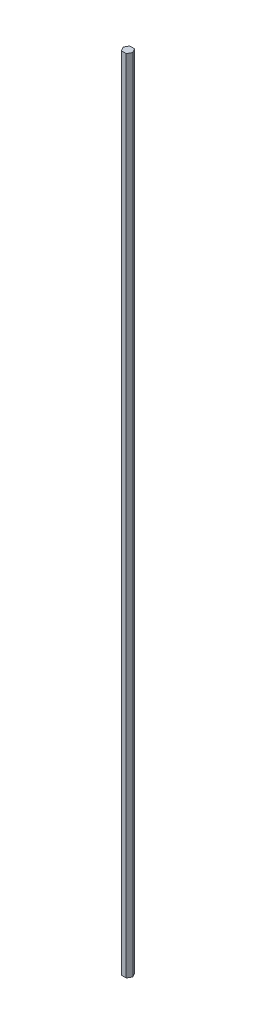
ISO-10303-21;
HEADER;
FILE_DESCRIPTION(('STEP AP214'),'2;1');
FILE_NAME('part.step','',(''),(''),'','','');
FILE_SCHEMA(('AUTOMOTIVE_DESIGN { 1 0 10303 214 1 1 1 1 }'));
ENDSEC;
DATA;
#1=APPLICATION_CONTEXT('core data for automotive mechanical design processes');
#2=APPLICATION_PROTOCOL_DEFINITION('international standard','automotive_design',2000,#1);
#3=PRODUCT_CONTEXT('',#1,'mechanical');
#4=PRODUCT('Part','Part','',(#3));
#5=PRODUCT_RELATED_PRODUCT_CATEGORY('part','',(#4));
#6=PRODUCT_DEFINITION_FORMATION('','',#4);
#7=PRODUCT_DEFINITION_CONTEXT('part definition',#1,'design');
#8=PRODUCT_DEFINITION('design','',#6,#7);
#9=PRODUCT_DEFINITION_SHAPE('','',#8);
#10=(LENGTH_UNIT() NAMED_UNIT(*) SI_UNIT(.MILLI.,.METRE.));
#11=(NAMED_UNIT(*) PLANE_ANGLE_UNIT() SI_UNIT($,.RADIAN.));
#12=(NAMED_UNIT(*) SI_UNIT($,.STERADIAN.) SOLID_ANGLE_UNIT());
#13=UNCERTAINTY_MEASURE_WITH_UNIT(LENGTH_MEASURE(1.E-05),#10,'distance_accuracy_value','');
#14=(GEOMETRIC_REPRESENTATION_CONTEXT(3) GLOBAL_UNCERTAINTY_ASSIGNED_CONTEXT((#13)) GLOBAL_UNIT_ASSIGNED_CONTEXT((#10,
#11,#12)) REPRESENTATION_CONTEXT('',''));
#15=CARTESIAN_POINT('',(0.,0.,0.));
#16=DIRECTION('',(0.,0.,1.));
#17=DIRECTION('',(1.,0.,0.));
#18=AXIS2_PLACEMENT_3D('',#15,#16,#17);
#19=CARTESIAN_POINT('',(-1.36356812882922,304.8,0.447318358355386));
#20=DIRECTION('',(-8.58853978460093E-05,0.,-0.999999996311849));
#21=DIRECTION('',(-0.999999996311849,0.,8.58853978460093E-05));
#22=AXIS2_PLACEMENT_3D('',#19,#20,#21);
#23=PLANE('',#22);
#24=DIRECTION('',(0.999999996311849,0.,-8.58853978460093E-05));
#25=VECTOR('',#24,1.);
#26=CARTESIAN_POINT('',(-1.36356812882922,0.,0.447318358355386));
#27=LINE('',#26,#25);
#28=CARTESIAN_POINT('',(-1.36356812882922,0.,0.447318358355386));
#29=VERTEX_POINT('',#28);
#30=CARTESIAN_POINT('',(0.469518969087139,0.,0.447160922940114));
#31=VERTEX_POINT('',#30);
#32=EDGE_CURVE('E117',#29,#31,#27,.T.);
#33=ORIENTED_EDGE('',*,*,#32,.T.);
#34=DIRECTION('',(0.,-1.,0.));
#35=VECTOR('',#34,1.);
#36=CARTESIAN_POINT('',(0.469518969087139,304.8,0.447160922940114));
#37=LINE('',#36,#35);
#38=CARTESIAN_POINT('',(0.469518969087139,304.8,0.447160922940114));
#39=VERTEX_POINT('',#38);
#40=EDGE_CURVE('E11',#39,#31,#37,.T.);
#41=ORIENTED_EDGE('',*,*,#40,.F.);
#42=DIRECTION('',(0.999999996311849,0.,-8.58853978460093E-05));
#43=VECTOR('',#42,1.);
#44=CARTESIAN_POINT('',(-1.36356812882922,304.8,0.447318358355386));
#45=LINE('',#44,#43);
#46=CARTESIAN_POINT('',(-1.36356812882922,304.8,0.447318358355386));
#47=VERTEX_POINT('',#46);
#48=EDGE_CURVE('E127',#47,#39,#45,.T.);
#49=ORIENTED_EDGE('',*,*,#48,.F.);
#50=DIRECTION('',(0.,-1.,0.));
#51=VECTOR('',#50,1.);
#52=CARTESIAN_POINT('',(-1.36356812882922,304.8,0.447318358355386));
#53=LINE('',#52,#51);
#54=EDGE_CURVE('E113',#47,#29,#53,.T.);
#55=ORIENTED_EDGE('',*,*,#54,.T.);
#56=EDGE_LOOP('',(#33,#41,#49,#55));
#57=FACE_BOUND('',#56,.T.);
#58=ADVANCED_FACE('F33',(#57),#23,.F.);
#59=CARTESIAN_POINT('',(0.469518969087139,304.8,0.447160922940114));
#60=DIRECTION('',(-0.86606834328933,0.,-0.499925619219575));
#61=DIRECTION('',(-0.499925619219575,0.,0.86606834328933));
#62=AXIS2_PLACEMENT_3D('',#59,#60,#61);
#63=PLANE('',#62);
#64=DIRECTION('',(0.499925619219575,0.,-0.86606834328933));
#65=VECTOR('',#64,1.);
#66=CARTESIAN_POINT('',(0.469518969087139,0.,0.447160922940114));
#67=LINE('',#66,#65);
#68=CARTESIAN_POINT('',(1.38592617497624,0.,-1.14041778891258));
#69=VERTEX_POINT('',#68);
#70=EDGE_CURVE('E120',#31,#69,#67,.T.);
#71=ORIENTED_EDGE('',*,*,#70,.T.);
#72=DIRECTION('',(0.,-1.,0.));
#73=VECTOR('',#72,1.);
#74=CARTESIAN_POINT('',(1.38592617497624,304.8,-1.14041778891258));
#75=LINE('',#74,#73);
#76=CARTESIAN_POINT('',(1.38592617497624,304.8,-1.14041778891258));
#77=VERTEX_POINT('',#76);
#78=EDGE_CURVE('E41',#77,#69,#75,.T.);
#79=ORIENTED_EDGE('',*,*,#78,.F.);
#80=DIRECTION('',(0.499925619219575,0.,-0.86606834328933));
#81=VECTOR('',#80,1.);
#82=CARTESIAN_POINT('',(0.469518969087139,304.8,0.447160922940114));
#83=LINE('',#82,#81);
#84=EDGE_CURVE('E86',#39,#77,#83,.T.);
#85=ORIENTED_EDGE('',*,*,#84,.F.);
#86=ORIENTED_EDGE('',*,*,#40,.T.);
#87=EDGE_LOOP('',(#71,#79,#85,#86));
#88=FACE_BOUND('',#87,.T.);
#89=ADVANCED_FACE('F151',(#88),#63,.F.);
#90=CARTESIAN_POINT('',(1.38592617497624,304.8,-1.14041778891258));
#91=DIRECTION('',(-0.865982457891483,0.,0.500074377092274));
#92=DIRECTION('',(0.500074377092274,0.,0.865982457891483));
#93=AXIS2_PLACEMENT_3D('',#90,#91,#92);
#94=PLANE('',#93);
#95=DIRECTION('',(-0.500074377092274,0.,-0.865982457891483));
#96=VECTOR('',#95,1.);
#97=CARTESIAN_POINT('',(1.38592617497624,0.,-1.14041778891258));
#98=LINE('',#97,#96);
#99=CARTESIAN_POINT('',(0.469246282948977,0.,-2.72783906535001));
#100=VERTEX_POINT('',#99);
#101=EDGE_CURVE('E122',#69,#100,#98,.T.);
#102=ORIENTED_EDGE('',*,*,#101,.T.);
#103=DIRECTION('',(0.,-1.,0.));
#104=VECTOR('',#103,1.);
#105=CARTESIAN_POINT('',(0.469246282948977,304.8,-2.72783906535001));
#106=LINE('',#105,#104);
#107=CARTESIAN_POINT('',(0.469246282948977,304.8,-2.72783906535001));
#108=VERTEX_POINT('',#107);
#109=EDGE_CURVE('E108',#108,#100,#106,.T.);
#110=ORIENTED_EDGE('',*,*,#109,.F.);
#111=DIRECTION('',(-0.500074377092274,0.,-0.865982457891483));
#112=VECTOR('',#111,1.);
#113=CARTESIAN_POINT('',(1.38592617497624,304.8,-1.14041778891258));
#114=LINE('',#113,#112);
#115=EDGE_CURVE('E99',#77,#108,#114,.T.);
#116=ORIENTED_EDGE('',*,*,#115,.F.);
#117=ORIENTED_EDGE('',*,*,#78,.T.);
#118=EDGE_LOOP('',(#102,#110,#116,#117));
#119=FACE_BOUND('',#118,.T.);
#120=ADVANCED_FACE('F133',(#119),#94,.F.);
#121=CARTESIAN_POINT('',(0.469246282948977,304.8,-2.72783906535001));
#122=DIRECTION('',(8.58853978460981E-05,0.,0.999999996311849));
#123=DIRECTION('',(0.999999996311849,0.,-8.58853978460981E-05));
#124=AXIS2_PLACEMENT_3D('',#121,#122,#123);
#125=PLANE('',#124);
#126=DIRECTION('',(-0.999999996311849,0.,8.58853978460981E-05));
#127=VECTOR('',#126,1.);
#128=CARTESIAN_POINT('',(0.469246282948977,0.,-2.72783906535001));
#129=LINE('',#128,#127);
#130=CARTESIAN_POINT('',(-1.36384081496738,0.,-2.72768162993474));
#131=VERTEX_POINT('',#130);
#132=EDGE_CURVE('E107',#100,#131,#129,.T.);
#133=ORIENTED_EDGE('',*,*,#132,.T.);
#134=DIRECTION('',(0.,-1.,0.));
#135=VECTOR('',#134,1.);
#136=CARTESIAN_POINT('',(-1.36384081496738,304.8,-2.72768162993474));
#137=LINE('',#136,#135);
#138=CARTESIAN_POINT('',(-1.36384081496738,304.8,-2.72768162993474));
#139=VERTEX_POINT('',#138);
#140=EDGE_CURVE('E104',#139,#131,#137,.T.);
#141=ORIENTED_EDGE('',*,*,#140,.F.);
#142=DIRECTION('',(-0.999999996311849,0.,8.58853978460981E-05));
#143=VECTOR('',#142,1.);
#144=CARTESIAN_POINT('',(0.469246282948977,304.8,-2.72783906535001));
#145=LINE('',#144,#143);
#146=EDGE_CURVE('E93',#108,#139,#145,.T.);
#147=ORIENTED_EDGE('',*,*,#146,.F.);
#148=ORIENTED_EDGE('',*,*,#109,.T.);
#149=EDGE_LOOP('',(#133,#141,#147,#148));
#150=FACE_BOUND('',#149,.T.);
#151=ADVANCED_FACE('F105',(#150),#125,.F.);
#152=CARTESIAN_POINT('',(-1.36384081496738,304.8,-2.72768162993474));
#153=DIRECTION('',(0.866068343289329,0.,0.499925619219576));
#154=DIRECTION('',(0.499925619219576,0.,-0.86606834328933));
#155=AXIS2_PLACEMENT_3D('',#152,#153,#154);
#156=PLANE('',#155);
#157=DIRECTION('',(-0.499925619219576,0.,0.866068343289329));
#158=VECTOR('',#157,1.);
#159=CARTESIAN_POINT('',(-1.36384081496738,0.,-2.72768162993474));
#160=LINE('',#159,#158);
#161=CARTESIAN_POINT('',(-2.28024802085648,0.,-1.14010291808204));
#162=VERTEX_POINT('',#161);
#163=EDGE_CURVE('E72',#131,#162,#160,.T.);
#164=ORIENTED_EDGE('',*,*,#163,.T.);
#165=DIRECTION('',(0.,-1.,0.));
#166=VECTOR('',#165,1.);
#167=CARTESIAN_POINT('',(-2.28024802085648,304.8,-1.14010291808204));
#168=LINE('',#167,#166);
#169=CARTESIAN_POINT('',(-2.28024802085648,304.8,-1.14010291808204));
#170=VERTEX_POINT('',#169);
#171=EDGE_CURVE('E109',#170,#162,#168,.T.);
#172=ORIENTED_EDGE('',*,*,#171,.F.);
#173=DIRECTION('',(-0.499925619219576,0.,0.866068343289329));
#174=VECTOR('',#173,1.);
#175=CARTESIAN_POINT('',(-1.36384081496738,304.8,-2.72768162993474));
#176=LINE('',#175,#174);
#177=EDGE_CURVE('E97',#139,#170,#176,.T.);
#178=ORIENTED_EDGE('',*,*,#177,.F.);
#179=ORIENTED_EDGE('',*,*,#140,.T.);
#180=EDGE_LOOP('',(#164,#172,#178,#179));
#181=FACE_BOUND('',#180,.T.);
#182=ADVANCED_FACE('F111',(#181),#156,.F.);
#183=CARTESIAN_POINT('',(-2.28024802085648,304.8,-1.14010291808204));
#184=DIRECTION('',(0.865982457891483,0.,-0.500074377092273));
#185=DIRECTION('',(-0.500074377092273,0.,-0.865982457891484));
#186=AXIS2_PLACEMENT_3D('',#183,#184,#185);
#187=PLANE('',#186);
#188=DIRECTION('',(0.500074377092273,0.,0.865982457891483));
#189=VECTOR('',#188,1.);
#190=CARTESIAN_POINT('',(-2.28024802085648,0.,-1.14010291808204));
#191=LINE('',#190,#189);
#192=EDGE_CURVE('E78',#162,#29,#191,.T.);
#193=ORIENTED_EDGE('',*,*,#192,.T.);
#194=ORIENTED_EDGE('',*,*,#54,.F.);
#195=DIRECTION('',(0.500074377092273,0.,0.865982457891483));
#196=VECTOR('',#195,1.);
#197=CARTESIAN_POINT('',(-2.28024802085648,304.8,-1.14010291808204));
#198=LINE('',#197,#196);
#199=EDGE_CURVE('E49',#170,#47,#198,.T.);
#200=ORIENTED_EDGE('',*,*,#199,.F.);
#201=ORIENTED_EDGE('',*,*,#171,.T.);
#202=EDGE_LOOP('',(#193,#194,#200,#201));
#203=FACE_BOUND('',#202,.T.);
#204=ADVANCED_FACE('F140',(#203),#187,.F.);
#205=CARTESIAN_POINT('',(0.,304.8,0.));
#206=DIRECTION('',(0.,1.,0.));
#207=DIRECTION('',(0.,0.,1.));
#208=AXIS2_PLACEMENT_3D('',#205,#206,#207);
#209=PLANE('',#208);
#210=ORIENTED_EDGE('',*,*,#48,.T.);
#211=ORIENTED_EDGE('',*,*,#84,.T.);
#212=ORIENTED_EDGE('',*,*,#115,.T.);
#213=ORIENTED_EDGE('',*,*,#146,.T.);
#214=ORIENTED_EDGE('',*,*,#177,.T.);
#215=ORIENTED_EDGE('',*,*,#199,.T.);
#216=EDGE_LOOP('',(#210,#211,#212,#213,#214,#215));
#217=FACE_BOUND('',#216,.T.);
#218=ADVANCED_FACE('F95',(#217),#209,.T.);
#219=CARTESIAN_POINT('',(0.,0.,0.));
#220=DIRECTION('',(0.,1.,0.));
#221=DIRECTION('',(0.,0.,1.));
#222=AXIS2_PLACEMENT_3D('',#219,#220,#221);
#223=PLANE('',#222);
#224=ORIENTED_EDGE('',*,*,#32,.F.);
#225=ORIENTED_EDGE('',*,*,#192,.F.);
#226=ORIENTED_EDGE('',*,*,#163,.F.);
#227=ORIENTED_EDGE('',*,*,#132,.F.);
#228=ORIENTED_EDGE('',*,*,#101,.F.);
#229=ORIENTED_EDGE('',*,*,#70,.F.);
#230=EDGE_LOOP('',(#224,#225,#226,#227,#228,#229));
#231=FACE_BOUND('',#230,.T.);
#232=ADVANCED_FACE('F136',(#231),#223,.F.);
#233=CLOSED_SHELL('',(#58,#89,#120,#151,#182,#204,#218,#232));
#234=MANIFOLD_SOLID_BREP('B2',#233);
#235=ADVANCED_BREP_SHAPE_REPRESENTATION('',(#18,#234),#14);
#236=SHAPE_DEFINITION_REPRESENTATION(#9,#235);
ENDSEC;
END-ISO-10303-21;
